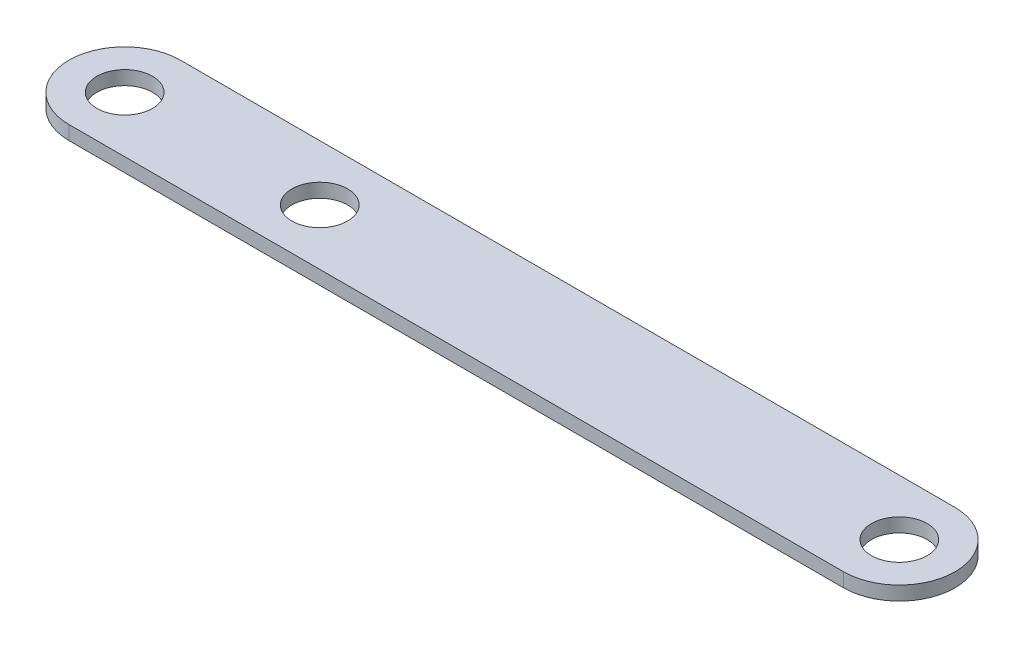
ISO-10303-21;
HEADER;
FILE_DESCRIPTION(('STEP AP214'),'2;1');
FILE_NAME('part.step','',(''),(''),'','','');
FILE_SCHEMA(('AUTOMOTIVE_DESIGN { 1 0 10303 214 1 1 1 1 }'));
ENDSEC;
DATA;
#1=APPLICATION_CONTEXT('core data for automotive mechanical design processes');
#2=APPLICATION_PROTOCOL_DEFINITION('international standard','automotive_design',2000,#1);
#3=PRODUCT_CONTEXT('',#1,'mechanical');
#4=PRODUCT('Part','Part','',(#3));
#5=PRODUCT_RELATED_PRODUCT_CATEGORY('part','',(#4));
#6=PRODUCT_DEFINITION_FORMATION('','',#4);
#7=PRODUCT_DEFINITION_CONTEXT('part definition',#1,'design');
#8=PRODUCT_DEFINITION('design','',#6,#7);
#9=PRODUCT_DEFINITION_SHAPE('','',#8);
#10=(LENGTH_UNIT() NAMED_UNIT(*) SI_UNIT(.MILLI.,.METRE.));
#11=(NAMED_UNIT(*) PLANE_ANGLE_UNIT() SI_UNIT($,.RADIAN.));
#12=(NAMED_UNIT(*) SI_UNIT($,.STERADIAN.) SOLID_ANGLE_UNIT());
#13=UNCERTAINTY_MEASURE_WITH_UNIT(LENGTH_MEASURE(1.E-05),#10,'distance_accuracy_value','');
#14=(GEOMETRIC_REPRESENTATION_CONTEXT(3) GLOBAL_UNCERTAINTY_ASSIGNED_CONTEXT((#13)) GLOBAL_UNIT_ASSIGNED_CONTEXT((#10,
#11,#12)) REPRESENTATION_CONTEXT('',''));
#15=CARTESIAN_POINT('',(0.,0.,0.));
#16=DIRECTION('',(0.,0.,1.));
#17=DIRECTION('',(1.,0.,0.));
#18=AXIS2_PLACEMENT_3D('',#15,#16,#17);
#19=CARTESIAN_POINT('',(0.,3.175,0.));
#20=DIRECTION('',(0.,1.,0.));
#21=DIRECTION('',(0.,0.,1.));
#22=AXIS2_PLACEMENT_3D('',#19,#20,#21);
#23=PLANE('',#22);
#24=CARTESIAN_POINT('',(44.45,3.175,0.));
#25=DIRECTION('',(0.,1.,0.));
#26=DIRECTION('',(0.,0.,1.));
#27=AXIS2_PLACEMENT_3D('',#24,#25,#26);
#28=CIRCLE('',#27,6.35);
#29=CARTESIAN_POINT('',(44.45,3.175,6.35));
#30=VERTEX_POINT('',#29);
#31=EDGE_CURVE('E117',#30,#30,#28,.T.);
#32=ORIENTED_EDGE('',*,*,#31,.F.);
#33=EDGE_LOOP('',(#32));
#34=FACE_BOUND('',#33,.T.);
#35=CARTESIAN_POINT('',(0.,3.175,0.));
#36=DIRECTION('',(0.,1.,0.));
#37=DIRECTION('',(0.,0.,1.));
#38=AXIS2_PLACEMENT_3D('',#35,#36,#37);
#39=CIRCLE('',#38,12.7);
#40=CARTESIAN_POINT('',(0.,3.175,-12.7));
#41=VERTEX_POINT('',#40);
#42=CARTESIAN_POINT('',(0.,3.175,12.7));
#43=VERTEX_POINT('',#42);
#44=EDGE_CURVE('E87',#41,#43,#39,.T.);
#45=ORIENTED_EDGE('',*,*,#44,.T.);
#46=DIRECTION('',(1.,0.,0.));
#47=VECTOR('',#46,1.);
#48=CARTESIAN_POINT('',(0.,3.175,12.7));
#49=LINE('',#48,#47);
#50=CARTESIAN_POINT('',(176.54778,3.175,12.7));
#51=VERTEX_POINT('',#50);
#52=EDGE_CURVE('E82',#43,#51,#49,.T.);
#53=ORIENTED_EDGE('',*,*,#52,.T.);
#54=CARTESIAN_POINT('',(176.54778,3.175,0.));
#55=DIRECTION('',(0.,1.,0.));
#56=DIRECTION('',(0.,0.,1.));
#57=AXIS2_PLACEMENT_3D('',#54,#55,#56);
#58=CIRCLE('',#57,12.7);
#59=CARTESIAN_POINT('',(176.54778,3.175,-12.7));
#60=VERTEX_POINT('',#59);
#61=EDGE_CURVE('E85',#51,#60,#58,.T.);
#62=ORIENTED_EDGE('',*,*,#61,.T.);
#63=DIRECTION('',(-1.,0.,0.));
#64=VECTOR('',#63,1.);
#65=CARTESIAN_POINT('',(0.,3.175,-12.7));
#66=LINE('',#65,#64);
#67=EDGE_CURVE('E52',#60,#41,#66,.T.);
#68=ORIENTED_EDGE('',*,*,#67,.T.);
#69=EDGE_LOOP('',(#45,#53,#62,#68));
#70=FACE_BOUND('',#69,.T.);
#71=CARTESIAN_POINT('',(0.,3.175,0.));
#72=DIRECTION('',(0.,1.,0.));
#73=DIRECTION('',(0.,0.,1.));
#74=AXIS2_PLACEMENT_3D('',#71,#72,#73);
#75=CIRCLE('',#74,6.35);
#76=CARTESIAN_POINT('',(0.,3.175,6.35));
#77=VERTEX_POINT('',#76);
#78=EDGE_CURVE('E102',#77,#77,#75,.T.);
#79=ORIENTED_EDGE('',*,*,#78,.F.);
#80=EDGE_LOOP('',(#79));
#81=FACE_BOUND('',#80,.T.);
#82=CARTESIAN_POINT('',(176.54778,3.175,0.));
#83=DIRECTION('',(0.,1.,0.));
#84=DIRECTION('',(0.,0.,1.));
#85=AXIS2_PLACEMENT_3D('',#82,#83,#84);
#86=CIRCLE('',#85,6.35);
#87=CARTESIAN_POINT('',(176.54778,3.175,6.35));
#88=VERTEX_POINT('',#87);
#89=EDGE_CURVE('E123',#88,#88,#86,.T.);
#90=ORIENTED_EDGE('',*,*,#89,.F.);
#91=EDGE_LOOP('',(#90));
#92=FACE_BOUND('',#91,.T.);
#93=ADVANCED_FACE('F35',(#34,#70,#81,#92),#23,.T.);
#94=CARTESIAN_POINT('',(0.,0.,0.));
#95=DIRECTION('',(0.,1.,0.));
#96=DIRECTION('',(0.,0.,1.));
#97=AXIS2_PLACEMENT_3D('',#94,#95,#96);
#98=PLANE('',#97);
#99=CARTESIAN_POINT('',(0.,0.,0.));
#100=DIRECTION('',(0.,1.,0.));
#101=DIRECTION('',(0.,0.,1.));
#102=AXIS2_PLACEMENT_3D('',#99,#100,#101);
#103=CIRCLE('',#102,12.7);
#104=CARTESIAN_POINT('',(0.,0.,-12.7));
#105=VERTEX_POINT('',#104);
#106=CARTESIAN_POINT('',(0.,0.,12.7));
#107=VERTEX_POINT('',#106);
#108=EDGE_CURVE('E99',#105,#107,#103,.T.);
#109=ORIENTED_EDGE('',*,*,#108,.F.);
#110=DIRECTION('',(-1.,0.,0.));
#111=VECTOR('',#110,1.);
#112=CARTESIAN_POINT('',(0.,0.,-12.7));
#113=LINE('',#112,#111);
#114=CARTESIAN_POINT('',(176.54778,0.,-12.7));
#115=VERTEX_POINT('',#114);
#116=EDGE_CURVE('E75',#115,#105,#113,.T.);
#117=ORIENTED_EDGE('',*,*,#116,.F.);
#118=CARTESIAN_POINT('',(176.54778,0.,0.));
#119=DIRECTION('',(0.,1.,0.));
#120=DIRECTION('',(0.,0.,1.));
#121=AXIS2_PLACEMENT_3D('',#118,#119,#120);
#122=CIRCLE('',#121,12.7);
#123=CARTESIAN_POINT('',(176.54778,0.,12.7));
#124=VERTEX_POINT('',#123);
#125=EDGE_CURVE('E69',#124,#115,#122,.T.);
#126=ORIENTED_EDGE('',*,*,#125,.F.);
#127=DIRECTION('',(1.,0.,0.));
#128=VECTOR('',#127,1.);
#129=CARTESIAN_POINT('',(0.,0.,12.7));
#130=LINE('',#129,#128);
#131=EDGE_CURVE('E91',#107,#124,#130,.T.);
#132=ORIENTED_EDGE('',*,*,#131,.F.);
#133=EDGE_LOOP('',(#109,#117,#126,#132));
#134=FACE_BOUND('',#133,.T.);
#135=CARTESIAN_POINT('',(0.,0.,0.));
#136=DIRECTION('',(0.,1.,0.));
#137=DIRECTION('',(0.,0.,1.));
#138=AXIS2_PLACEMENT_3D('',#135,#136,#137);
#139=CIRCLE('',#138,6.35);
#140=CARTESIAN_POINT('',(0.,0.,6.35));
#141=VERTEX_POINT('',#140);
#142=EDGE_CURVE('E114',#141,#141,#139,.T.);
#143=ORIENTED_EDGE('',*,*,#142,.T.);
#144=EDGE_LOOP('',(#143));
#145=FACE_BOUND('',#144,.T.);
#146=CARTESIAN_POINT('',(44.45,0.,0.));
#147=DIRECTION('',(0.,1.,0.));
#148=DIRECTION('',(0.,0.,1.));
#149=AXIS2_PLACEMENT_3D('',#146,#147,#148);
#150=CIRCLE('',#149,6.35);
#151=CARTESIAN_POINT('',(44.45,0.,6.35));
#152=VERTEX_POINT('',#151);
#153=EDGE_CURVE('E120',#152,#152,#150,.T.);
#154=ORIENTED_EDGE('',*,*,#153,.T.);
#155=EDGE_LOOP('',(#154));
#156=FACE_BOUND('',#155,.T.);
#157=CARTESIAN_POINT('',(176.54778,0.,0.));
#158=DIRECTION('',(0.,1.,0.));
#159=DIRECTION('',(0.,0.,1.));
#160=AXIS2_PLACEMENT_3D('',#157,#158,#159);
#161=CIRCLE('',#160,6.35);
#162=CARTESIAN_POINT('',(176.54778,0.,6.35));
#163=VERTEX_POINT('',#162);
#164=EDGE_CURVE('E126',#163,#163,#161,.T.);
#165=ORIENTED_EDGE('',*,*,#164,.T.);
#166=EDGE_LOOP('',(#165));
#167=FACE_BOUND('',#166,.T.);
#168=ADVANCED_FACE('F110',(#134,#145,#156,#167),#98,.F.);
#169=CARTESIAN_POINT('',(0.,3.175,0.));
#170=DIRECTION('',(0.,-1.,0.));
#171=DIRECTION('',(0.,0.,-1.));
#172=AXIS2_PLACEMENT_3D('',#169,#170,#171);
#173=CYLINDRICAL_SURFACE('',#172,12.7);
#174=ORIENTED_EDGE('',*,*,#108,.T.);
#175=DIRECTION('',(0.,-1.,0.));
#176=VECTOR('',#175,1.);
#177=CARTESIAN_POINT('',(0.,3.175,12.7));
#178=LINE('',#177,#176);
#179=EDGE_CURVE('E11',#43,#107,#178,.T.);
#180=ORIENTED_EDGE('',*,*,#179,.F.);
#181=ORIENTED_EDGE('',*,*,#44,.F.);
#182=DIRECTION('',(0.,-1.,0.));
#183=VECTOR('',#182,1.);
#184=CARTESIAN_POINT('',(0.,3.175,-12.7));
#185=LINE('',#184,#183);
#186=EDGE_CURVE('E95',#41,#105,#185,.T.);
#187=ORIENTED_EDGE('',*,*,#186,.T.);
#188=EDGE_LOOP('',(#174,#180,#181,#187));
#189=FACE_BOUND('',#188,.T.);
#190=ADVANCED_FACE('F37',(#189),#173,.T.);
#191=CARTESIAN_POINT('',(0.,3.175,12.7));
#192=DIRECTION('',(0.,0.,-1.));
#193=DIRECTION('',(-1.,0.,0.));
#194=AXIS2_PLACEMENT_3D('',#191,#192,#193);
#195=PLANE('',#194);
#196=ORIENTED_EDGE('',*,*,#131,.T.);
#197=DIRECTION('',(0.,-1.,0.));
#198=VECTOR('',#197,1.);
#199=CARTESIAN_POINT('',(176.54778,3.175,12.7));
#200=LINE('',#199,#198);
#201=EDGE_CURVE('E44',#51,#124,#200,.T.);
#202=ORIENTED_EDGE('',*,*,#201,.F.);
#203=ORIENTED_EDGE('',*,*,#52,.F.);
#204=ORIENTED_EDGE('',*,*,#179,.T.);
#205=EDGE_LOOP('',(#196,#202,#203,#204));
#206=FACE_BOUND('',#205,.T.);
#207=ADVANCED_FACE('F90',(#206),#195,.F.);
#208=CARTESIAN_POINT('',(176.54778,3.175,0.));
#209=DIRECTION('',(0.,-1.,0.));
#210=DIRECTION('',(0.,0.,-1.));
#211=AXIS2_PLACEMENT_3D('',#208,#209,#210);
#212=CYLINDRICAL_SURFACE('',#211,12.7);
#213=ORIENTED_EDGE('',*,*,#125,.T.);
#214=DIRECTION('',(0.,-1.,0.));
#215=VECTOR('',#214,1.);
#216=CARTESIAN_POINT('',(176.54778,3.175,-12.7));
#217=LINE('',#216,#215);
#218=EDGE_CURVE('E92',#60,#115,#217,.T.);
#219=ORIENTED_EDGE('',*,*,#218,.F.);
#220=ORIENTED_EDGE('',*,*,#61,.F.);
#221=ORIENTED_EDGE('',*,*,#201,.T.);
#222=EDGE_LOOP('',(#213,#219,#220,#221));
#223=FACE_BOUND('',#222,.T.);
#224=ADVANCED_FACE('F93',(#223),#212,.T.);
#225=CARTESIAN_POINT('',(0.,3.175,-12.7));
#226=DIRECTION('',(0.,0.,1.));
#227=DIRECTION('',(1.,0.,0.));
#228=AXIS2_PLACEMENT_3D('',#225,#226,#227);
#229=PLANE('',#228);
#230=ORIENTED_EDGE('',*,*,#116,.T.);
#231=ORIENTED_EDGE('',*,*,#186,.F.);
#232=ORIENTED_EDGE('',*,*,#67,.F.);
#233=ORIENTED_EDGE('',*,*,#218,.T.);
#234=EDGE_LOOP('',(#230,#231,#232,#233));
#235=FACE_BOUND('',#234,.T.);
#236=ADVANCED_FACE('F107',(#235),#229,.F.);
#237=CARTESIAN_POINT('',(0.,3.175,0.));
#238=DIRECTION('',(0.,-1.,0.));
#239=DIRECTION('',(0.,0.,-1.));
#240=AXIS2_PLACEMENT_3D('',#237,#238,#239);
#241=CYLINDRICAL_SURFACE('',#240,6.35);
#242=ORIENTED_EDGE('',*,*,#78,.T.);
#243=EDGE_LOOP('',(#242));
#244=FACE_BOUND('',#243,.T.);
#245=ORIENTED_EDGE('',*,*,#142,.F.);
#246=EDGE_LOOP('',(#245));
#247=FACE_BOUND('',#246,.T.);
#248=ADVANCED_FACE('F144',(#244,#247),#241,.F.);
#249=CARTESIAN_POINT('',(44.45,3.175,0.));
#250=DIRECTION('',(0.,-1.,0.));
#251=DIRECTION('',(0.,0.,-1.));
#252=AXIS2_PLACEMENT_3D('',#249,#250,#251);
#253=CYLINDRICAL_SURFACE('',#252,6.35);
#254=ORIENTED_EDGE('',*,*,#31,.T.);
#255=EDGE_LOOP('',(#254));
#256=FACE_BOUND('',#255,.T.);
#257=ORIENTED_EDGE('',*,*,#153,.F.);
#258=EDGE_LOOP('',(#257));
#259=FACE_BOUND('',#258,.T.);
#260=ADVANCED_FACE('F190',(#256,#259),#253,.F.);
#261=CARTESIAN_POINT('',(176.54778,3.175,0.));
#262=DIRECTION('',(0.,-1.,0.));
#263=DIRECTION('',(0.,0.,-1.));
#264=AXIS2_PLACEMENT_3D('',#261,#262,#263);
#265=CYLINDRICAL_SURFACE('',#264,6.35);
#266=ORIENTED_EDGE('',*,*,#89,.T.);
#267=EDGE_LOOP('',(#266));
#268=FACE_BOUND('',#267,.T.);
#269=ORIENTED_EDGE('',*,*,#164,.F.);
#270=EDGE_LOOP('',(#269));
#271=FACE_BOUND('',#270,.T.);
#272=ADVANCED_FACE('F132',(#268,#271),#265,.F.);
#273=CLOSED_SHELL('',(#93,#168,#190,#207,#224,#236,#248,#260,#272));
#274=MANIFOLD_SOLID_BREP('B2',#273);
#275=ADVANCED_BREP_SHAPE_REPRESENTATION('',(#18,#274),#14);
#276=SHAPE_DEFINITION_REPRESENTATION(#9,#275);
ENDSEC;
END-ISO-10303-21;
